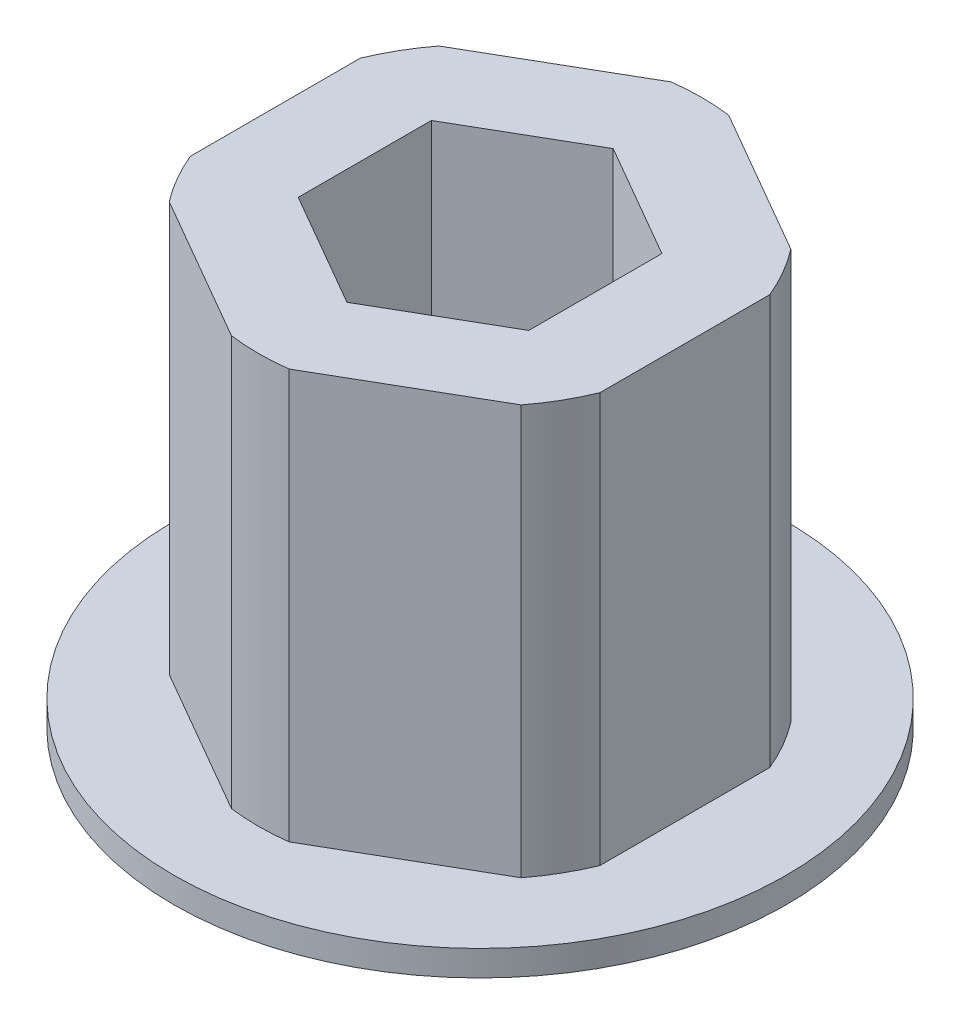
ISO-10303-21;
HEADER;
FILE_DESCRIPTION(('STEP AP214'),'2;1');
FILE_NAME('part.step','',(''),(''),'','','');
FILE_SCHEMA(('AUTOMOTIVE_DESIGN { 1 0 10303 214 1 1 1 1 }'));
ENDSEC;
DATA;
#1=APPLICATION_CONTEXT('core data for automotive mechanical design processes');
#2=APPLICATION_PROTOCOL_DEFINITION('international standard','automotive_design',2000,#1);
#3=PRODUCT_CONTEXT('',#1,'mechanical');
#4=PRODUCT('Part','Part','',(#3));
#5=PRODUCT_RELATED_PRODUCT_CATEGORY('part','',(#4));
#6=PRODUCT_DEFINITION_FORMATION('','',#4);
#7=PRODUCT_DEFINITION_CONTEXT('part definition',#1,'design');
#8=PRODUCT_DEFINITION('design','',#6,#7);
#9=PRODUCT_DEFINITION_SHAPE('','',#8);
#10=(LENGTH_UNIT() NAMED_UNIT(*) SI_UNIT(.MILLI.,.METRE.));
#11=(NAMED_UNIT(*) PLANE_ANGLE_UNIT() SI_UNIT($,.RADIAN.));
#12=(NAMED_UNIT(*) SI_UNIT($,.STERADIAN.) SOLID_ANGLE_UNIT());
#13=UNCERTAINTY_MEASURE_WITH_UNIT(LENGTH_MEASURE(1.E-05),#10,'distance_accuracy_value','');
#14=(GEOMETRIC_REPRESENTATION_CONTEXT(3) GLOBAL_UNCERTAINTY_ASSIGNED_CONTEXT((#13)) GLOBAL_UNIT_ASSIGNED_CONTEXT((#10,
#11,#12)) REPRESENTATION_CONTEXT('',''));
#15=CARTESIAN_POINT('',(0.,0.,0.));
#16=DIRECTION('',(0.,0.,1.));
#17=DIRECTION('',(1.,0.,0.));
#18=AXIS2_PLACEMENT_3D('',#15,#16,#17);
#19=CARTESIAN_POINT('',(0.,0.79375,0.));
#20=DIRECTION('',(0.,1.,0.));
#21=DIRECTION('',(0.,0.,1.));
#22=AXIS2_PLACEMENT_3D('',#19,#20,#21);
#23=PLANE('',#22);
#24=CARTESIAN_POINT('',(0.,0.79375,0.));
#25=DIRECTION('',(0.,1.,0.));
#26=DIRECTION('',(0.,0.,1.));
#27=AXIS2_PLACEMENT_3D('',#24,#25,#26);
#28=CIRCLE('',#27,6.875);
#29=CARTESIAN_POINT('',(5.45696050579321,0.79375,4.18177080173138));
#30=VERTEX_POINT('',#29);
#31=CARTESIAN_POINT('',(6.35,0.79375,2.63498102459961));
#32=VERTEX_POINT('',#31);
#33=EDGE_CURVE('E199',#30,#32,#28,.T.);
#34=ORIENTED_EDGE('',*,*,#33,.F.);
#35=DIRECTION('',(0.866025403784439,0.,-0.5));
#36=VECTOR('',#35,1.);
#37=CARTESIAN_POINT('',(3.175,0.79375,5.49926131403118));
#38=LINE('',#37,#36);
#39=CARTESIAN_POINT('',(0.893039494206787,0.79375,6.81675182633099));
#40=VERTEX_POINT('',#39);
#41=EDGE_CURVE('E228',#40,#30,#38,.T.);
#42=ORIENTED_EDGE('',*,*,#41,.F.);
#43=CARTESIAN_POINT('',(-0.893039494206786,0.793749999999999,6.81675182633099));
#44=VERTEX_POINT('',#43);
#45=EDGE_CURVE('E194',#44,#40,#28,.T.);
#46=ORIENTED_EDGE('',*,*,#45,.F.);
#47=DIRECTION('',(0.866025403784439,0.,0.5));
#48=VECTOR('',#47,1.);
#49=CARTESIAN_POINT('',(-3.175,0.79375,5.49926131403118));
#50=LINE('',#49,#48);
#51=CARTESIAN_POINT('',(-5.45696050579321,0.79375,4.18177080173138));
#52=VERTEX_POINT('',#51);
#53=EDGE_CURVE('E196',#52,#44,#50,.T.);
#54=ORIENTED_EDGE('',*,*,#53,.F.);
#55=CARTESIAN_POINT('',(-6.35,0.79375,2.63498102459961));
#56=VERTEX_POINT('',#55);
#57=EDGE_CURVE('E198',#56,#52,#28,.T.);
#58=ORIENTED_EDGE('',*,*,#57,.F.);
#59=DIRECTION('',(0.,0.,1.));
#60=VECTOR('',#59,1.);
#61=CARTESIAN_POINT('',(-6.35,0.79375,0.));
#62=LINE('',#61,#60);
#63=CARTESIAN_POINT('',(-6.35,0.79375,-2.63498102459961));
#64=VERTEX_POINT('',#63);
#65=EDGE_CURVE('E240',#64,#56,#62,.T.);
#66=ORIENTED_EDGE('',*,*,#65,.F.);
#67=CARTESIAN_POINT('',(-5.45696050579321,0.79375,-4.18177080173138));
#68=VERTEX_POINT('',#67);
#69=EDGE_CURVE('E239',#68,#64,#28,.T.);
#70=ORIENTED_EDGE('',*,*,#69,.F.);
#71=DIRECTION('',(-0.866025403784439,0.,0.5));
#72=VECTOR('',#71,1.);
#73=CARTESIAN_POINT('',(-3.175,0.79375,-5.49926131403119));
#74=LINE('',#73,#72);
#75=CARTESIAN_POINT('',(-0.893039494206791,0.79375,-6.81675182633099));
#76=VERTEX_POINT('',#75);
#77=EDGE_CURVE('E237',#76,#68,#74,.T.);
#78=ORIENTED_EDGE('',*,*,#77,.F.);
#79=CARTESIAN_POINT('',(0.893039494206787,0.79375,-6.81675182633099));
#80=VERTEX_POINT('',#79);
#81=EDGE_CURVE('E236',#80,#76,#28,.T.);
#82=ORIENTED_EDGE('',*,*,#81,.F.);
#83=DIRECTION('',(-0.866025403784439,0.,-0.5));
#84=VECTOR('',#83,1.);
#85=CARTESIAN_POINT('',(3.175,0.79375,-5.49926131403118));
#86=LINE('',#85,#84);
#87=CARTESIAN_POINT('',(5.45696050579321,0.79375,-4.18177080173138));
#88=VERTEX_POINT('',#87);
#89=EDGE_CURVE('E234',#88,#80,#86,.T.);
#90=ORIENTED_EDGE('',*,*,#89,.F.);
#91=CARTESIAN_POINT('',(6.35,0.79375,-2.63498102459961));
#92=VERTEX_POINT('',#91);
#93=EDGE_CURVE('E232',#92,#88,#28,.T.);
#94=ORIENTED_EDGE('',*,*,#93,.F.);
#95=DIRECTION('',(0.,0.,-1.));
#96=VECTOR('',#95,1.);
#97=CARTESIAN_POINT('',(6.35,0.79375,0.));
#98=LINE('',#97,#96);
#99=EDGE_CURVE('E231',#32,#92,#98,.T.);
#100=ORIENTED_EDGE('',*,*,#99,.F.);
#101=EDGE_LOOP('',(#34,#42,#46,#54,#58,#66,#70,#78,#82,#90,#94,#100));
#102=FACE_BOUND('',#101,.T.);
#103=CARTESIAN_POINT('',(0.,0.79375,0.));
#104=DIRECTION('',(0.,1.,0.));
#105=DIRECTION('',(0.,0.,1.));
#106=AXIS2_PLACEMENT_3D('',#103,#104,#105);
#107=CIRCLE('',#106,9.5);
#108=CARTESIAN_POINT('',(0.,0.79375,9.5));
#109=VERTEX_POINT('',#108);
#110=EDGE_CURVE('E11',#109,#109,#107,.T.);
#111=ORIENTED_EDGE('',*,*,#110,.T.);
#112=EDGE_LOOP('',(#111));
#113=FACE_BOUND('',#112,.T.);
#114=ADVANCED_FACE('F41',(#102,#113),#23,.T.);
#115=CARTESIAN_POINT('',(0.,0.,0.));
#116=DIRECTION('',(0.,1.,0.));
#117=DIRECTION('',(0.,0.,1.));
#118=AXIS2_PLACEMENT_3D('',#115,#116,#117);
#119=PLANE('',#118);
#120=CARTESIAN_POINT('',(0.,0.,0.));
#121=DIRECTION('',(0.,1.,0.));
#122=DIRECTION('',(0.,0.,1.));
#123=AXIS2_PLACEMENT_3D('',#120,#121,#122);
#124=CIRCLE('',#123,9.5);
#125=CARTESIAN_POINT('',(0.,0.,9.5));
#126=VERTEX_POINT('',#125);
#127=EDGE_CURVE('E45',#126,#126,#124,.T.);
#128=ORIENTED_EDGE('',*,*,#127,.F.);
#129=EDGE_LOOP('',(#128));
#130=FACE_BOUND('',#129,.T.);
#131=DIRECTION('',(-0.866025403784442,0.,-0.499999999999995));
#132=VECTOR('',#131,1.);
#133=CARTESIAN_POINT('',(3.57499999999998,0.,-2.06402721235295));
#134=LINE('',#133,#132);
#135=CARTESIAN_POINT('',(3.57499999999998,0.,-2.06402721235295));
#136=VERTEX_POINT('',#135);
#137=CARTESIAN_POINT('',(0.,0.,-4.12805442470582));
#138=VERTEX_POINT('',#137);
#139=EDGE_CURVE('E64',#136,#138,#134,.T.);
#140=ORIENTED_EDGE('',*,*,#139,.T.);
#141=DIRECTION('',(-0.866025403784438,0.,0.500000000000001));
#142=VECTOR('',#141,1.);
#143=CARTESIAN_POINT('',(0.,0.,-4.12805442470582));
#144=LINE('',#143,#142);
#145=CARTESIAN_POINT('',(-3.575,0.,-2.0640272123529));
#146=VERTEX_POINT('',#145);
#147=EDGE_CURVE('E277',#138,#146,#144,.T.);
#148=ORIENTED_EDGE('',*,*,#147,.T.);
#149=DIRECTION('',(0.,0.,1.));
#150=VECTOR('',#149,1.);
#151=CARTESIAN_POINT('',(-3.575,0.,-2.0640272123529));
#152=LINE('',#151,#150);
#153=CARTESIAN_POINT('',(-3.57499999999999,0.,2.06402721235293));
#154=VERTEX_POINT('',#153);
#155=EDGE_CURVE('E174',#146,#154,#152,.T.);
#156=ORIENTED_EDGE('',*,*,#155,.T.);
#157=DIRECTION('',(0.866025403784441,0.,0.499999999999995));
#158=VECTOR('',#157,1.);
#159=CARTESIAN_POINT('',(-3.57499999999999,0.,2.06402721235293));
#160=LINE('',#159,#158);
#161=CARTESIAN_POINT('',(0.,0.,4.12805442470582));
#162=VERTEX_POINT('',#161);
#163=EDGE_CURVE('E280',#154,#162,#160,.T.);
#164=ORIENTED_EDGE('',*,*,#163,.T.);
#165=DIRECTION('',(0.866025403784435,0.,-0.500000000000007));
#166=VECTOR('',#165,1.);
#167=CARTESIAN_POINT('',(0.,0.,4.12805442470582));
#168=LINE('',#167,#166);
#169=CARTESIAN_POINT('',(3.57500000000002,0.,2.06402721235288));
#170=VERTEX_POINT('',#169);
#171=EDGE_CURVE('E283',#162,#170,#168,.T.);
#172=ORIENTED_EDGE('',*,*,#171,.T.);
#173=DIRECTION('',(0.,0.,-1.));
#174=VECTOR('',#173,1.);
#175=CARTESIAN_POINT('',(3.57500000000002,0.,2.06402721235288));
#176=LINE('',#175,#174);
#177=EDGE_CURVE('E286',#170,#136,#176,.T.);
#178=ORIENTED_EDGE('',*,*,#177,.T.);
#179=EDGE_LOOP('',(#140,#148,#156,#164,#172,#178));
#180=FACE_BOUND('',#179,.T.);
#181=ADVANCED_FACE('F300',(#130,#180),#119,.F.);
#182=CARTESIAN_POINT('',(0.,0.79375,0.));
#183=DIRECTION('',(0.,-1.,0.));
#184=DIRECTION('',(0.,0.,-1.));
#185=AXIS2_PLACEMENT_3D('',#182,#183,#184);
#186=CYLINDRICAL_SURFACE('',#185,9.5);
#187=ORIENTED_EDGE('',*,*,#110,.F.);
#188=EDGE_LOOP('',(#187));
#189=FACE_BOUND('',#188,.T.);
#190=ORIENTED_EDGE('',*,*,#127,.T.);
#191=EDGE_LOOP('',(#190));
#192=FACE_BOUND('',#191,.T.);
#193=ADVANCED_FACE('F43',(#189,#192),#186,.T.);
#194=CARTESIAN_POINT('',(3.57499999999998,0.79375,-2.06402721235295));
#195=DIRECTION('',(-0.499999999999995,0.,0.866025403784442));
#196=DIRECTION('',(0.866025403784442,0.,0.499999999999995));
#197=AXIS2_PLACEMENT_3D('',#194,#195,#196);
#198=PLANE('',#197);
#199=ORIENTED_EDGE('',*,*,#139,.F.);
#200=DIRECTION('',(0.,-1.,0.));
#201=VECTOR('',#200,1.);
#202=CARTESIAN_POINT('',(3.57499999999998,0.79375,-2.06402721235295));
#203=LINE('',#202,#201);
#204=CARTESIAN_POINT('',(3.57499999999998,13.49375,-2.06402721235295));
#205=VERTEX_POINT('',#204);
#206=EDGE_CURVE('E289',#205,#136,#203,.T.);
#207=ORIENTED_EDGE('',*,*,#206,.F.);
#208=DIRECTION('',(0.866025403784442,0.,0.499999999999995));
#209=VECTOR('',#208,1.);
#210=CARTESIAN_POINT('',(1.78749999999999,13.49375,-3.09604081852939));
#211=LINE('',#210,#209);
#212=CARTESIAN_POINT('',(0.,13.49375,-4.12805442470582));
#213=VERTEX_POINT('',#212);
#214=EDGE_CURVE('E186',#213,#205,#211,.T.);
#215=ORIENTED_EDGE('',*,*,#214,.F.);
#216=DIRECTION('',(0.,-1.,0.));
#217=VECTOR('',#216,1.);
#218=CARTESIAN_POINT('',(0.,0.79375,-4.12805442470582));
#219=LINE('',#218,#217);
#220=EDGE_CURVE('E177',#213,#138,#219,.T.);
#221=ORIENTED_EDGE('',*,*,#220,.T.);
#222=EDGE_LOOP('',(#199,#207,#215,#221));
#223=FACE_BOUND('',#222,.T.);
#224=ADVANCED_FACE('F308',(#223),#198,.T.);
#225=CARTESIAN_POINT('',(0.,0.79375,-4.12805442470582));
#226=DIRECTION('',(0.500000000000001,0.,0.866025403784438));
#227=DIRECTION('',(0.866025403784438,0.,-0.500000000000001));
#228=AXIS2_PLACEMENT_3D('',#225,#226,#227);
#229=PLANE('',#228);
#230=ORIENTED_EDGE('',*,*,#147,.F.);
#231=ORIENTED_EDGE('',*,*,#220,.F.);
#232=DIRECTION('',(0.866025403784438,0.,-0.500000000000001));
#233=VECTOR('',#232,1.);
#234=CARTESIAN_POINT('',(-1.7875,13.49375,-3.09604081852936));
#235=LINE('',#234,#233);
#236=CARTESIAN_POINT('',(-3.575,13.49375,-2.0640272123529));
#237=VERTEX_POINT('',#236);
#238=EDGE_CURVE('E181',#237,#213,#235,.T.);
#239=ORIENTED_EDGE('',*,*,#238,.F.);
#240=DIRECTION('',(0.,-1.,0.));
#241=VECTOR('',#240,1.);
#242=CARTESIAN_POINT('',(-3.575,0.79375,-2.0640272123529));
#243=LINE('',#242,#241);
#244=EDGE_CURVE('E168',#237,#146,#243,.T.);
#245=ORIENTED_EDGE('',*,*,#244,.T.);
#246=EDGE_LOOP('',(#230,#231,#239,#245));
#247=FACE_BOUND('',#246,.T.);
#248=ADVANCED_FACE('F182',(#247),#229,.T.);
#249=CARTESIAN_POINT('',(-3.575,0.79375,-2.0640272123529));
#250=DIRECTION('',(1.,0.,0.));
#251=DIRECTION('',(0.,0.,-1.));
#252=AXIS2_PLACEMENT_3D('',#249,#250,#251);
#253=PLANE('',#252);
#254=ORIENTED_EDGE('',*,*,#155,.F.);
#255=ORIENTED_EDGE('',*,*,#244,.F.);
#256=DIRECTION('',(0.,0.,-1.));
#257=VECTOR('',#256,1.);
#258=CARTESIAN_POINT('',(-3.575,13.49375,0.));
#259=LINE('',#258,#257);
#260=CARTESIAN_POINT('',(-3.57499999999999,13.49375,2.06402721235293));
#261=VERTEX_POINT('',#260);
#262=EDGE_CURVE('E172',#261,#237,#259,.T.);
#263=ORIENTED_EDGE('',*,*,#262,.F.);
#264=DIRECTION('',(0.,-1.,0.));
#265=VECTOR('',#264,1.);
#266=CARTESIAN_POINT('',(-3.57499999999999,0.79375,2.06402721235293));
#267=LINE('',#266,#265);
#268=EDGE_CURVE('E178',#261,#154,#267,.T.);
#269=ORIENTED_EDGE('',*,*,#268,.T.);
#270=EDGE_LOOP('',(#254,#255,#263,#269));
#271=FACE_BOUND('',#270,.T.);
#272=ADVANCED_FACE('F170',(#271),#253,.T.);
#273=CARTESIAN_POINT('',(-3.57499999999999,0.79375,2.06402721235293));
#274=DIRECTION('',(0.499999999999995,0.,-0.866025403784441));
#275=DIRECTION('',(-0.866025403784441,0.,-0.499999999999995));
#276=AXIS2_PLACEMENT_3D('',#273,#274,#275);
#277=PLANE('',#276);
#278=ORIENTED_EDGE('',*,*,#163,.F.);
#279=ORIENTED_EDGE('',*,*,#268,.F.);
#280=DIRECTION('',(-0.866025403784442,0.,-0.499999999999995));
#281=VECTOR('',#280,1.);
#282=CARTESIAN_POINT('',(-1.78749999999998,13.49375,3.09604081852938));
#283=LINE('',#282,#281);
#284=CARTESIAN_POINT('',(0.,13.49375,4.12805442470582));
#285=VERTEX_POINT('',#284);
#286=EDGE_CURVE('E193',#285,#261,#283,.T.);
#287=ORIENTED_EDGE('',*,*,#286,.F.);
#288=DIRECTION('',(0.,-1.,0.));
#289=VECTOR('',#288,1.);
#290=CARTESIAN_POINT('',(0.,0.79375,4.12805442470582));
#291=LINE('',#290,#289);
#292=EDGE_CURVE('E293',#285,#162,#291,.T.);
#293=ORIENTED_EDGE('',*,*,#292,.T.);
#294=EDGE_LOOP('',(#278,#279,#287,#293));
#295=FACE_BOUND('',#294,.T.);
#296=ADVANCED_FACE('F314',(#295),#277,.T.);
#297=CARTESIAN_POINT('',(0.,0.79375,4.12805442470582));
#298=DIRECTION('',(-0.500000000000007,0.,-0.866025403784434));
#299=DIRECTION('',(-0.866025403784435,0.,0.500000000000007));
#300=AXIS2_PLACEMENT_3D('',#297,#298,#299);
#301=PLANE('',#300);
#302=ORIENTED_EDGE('',*,*,#171,.F.);
#303=ORIENTED_EDGE('',*,*,#292,.F.);
#304=DIRECTION('',(-0.866025403784435,0.,0.500000000000007));
#305=VECTOR('',#304,1.);
#306=CARTESIAN_POINT('',(1.78750000000002,13.49375,3.09604081852935));
#307=LINE('',#306,#305);
#308=CARTESIAN_POINT('',(3.57500000000002,13.49375,2.06402721235288));
#309=VERTEX_POINT('',#308);
#310=EDGE_CURVE('E205',#309,#285,#307,.T.);
#311=ORIENTED_EDGE('',*,*,#310,.F.);
#312=DIRECTION('',(0.,-1.,0.));
#313=VECTOR('',#312,1.);
#314=CARTESIAN_POINT('',(3.57500000000002,0.79375,2.06402721235288));
#315=LINE('',#314,#313);
#316=EDGE_CURVE('E291',#309,#170,#315,.T.);
#317=ORIENTED_EDGE('',*,*,#316,.T.);
#318=EDGE_LOOP('',(#302,#303,#311,#317));
#319=FACE_BOUND('',#318,.T.);
#320=ADVANCED_FACE('F311',(#319),#301,.T.);
#321=CARTESIAN_POINT('',(3.57500000000002,0.79375,2.06402721235288));
#322=DIRECTION('',(-1.,0.,0.));
#323=DIRECTION('',(0.,0.,1.));
#324=AXIS2_PLACEMENT_3D('',#321,#322,#323);
#325=PLANE('',#324);
#326=ORIENTED_EDGE('',*,*,#177,.F.);
#327=ORIENTED_EDGE('',*,*,#316,.F.);
#328=DIRECTION('',(0.,0.,1.));
#329=VECTOR('',#328,1.);
#330=CARTESIAN_POINT('',(3.575,13.49375,0.));
#331=LINE('',#330,#329);
#332=EDGE_CURVE('E202',#205,#309,#331,.T.);
#333=ORIENTED_EDGE('',*,*,#332,.F.);
#334=ORIENTED_EDGE('',*,*,#206,.T.);
#335=EDGE_LOOP('',(#326,#327,#333,#334));
#336=FACE_BOUND('',#335,.T.);
#337=ADVANCED_FACE('F306',(#336),#325,.T.);
#338=CARTESIAN_POINT('',(3.175,13.49375,5.49926131403118));
#339=DIRECTION('',(-0.5,0.,-0.866025403784439));
#340=DIRECTION('',(-0.866025403784439,0.,0.5));
#341=AXIS2_PLACEMENT_3D('',#338,#339,#340);
#342=PLANE('',#341);
#343=ORIENTED_EDGE('',*,*,#41,.T.);
#344=DIRECTION('',(0.,-1.,0.));
#345=VECTOR('',#344,1.);
#346=CARTESIAN_POINT('',(5.45696050579321,13.49375,4.18177080173138));
#347=LINE('',#346,#345);
#348=CARTESIAN_POINT('',(5.45696050579321,13.49375,4.18177080173138));
#349=VERTEX_POINT('',#348);
#350=EDGE_CURVE('E274',#349,#30,#347,.T.);
#351=ORIENTED_EDGE('',*,*,#350,.F.);
#352=DIRECTION('',(0.866025403784439,0.,-0.5));
#353=VECTOR('',#352,1.);
#354=CARTESIAN_POINT('',(3.175,13.49375,5.49926131403118));
#355=LINE('',#354,#353);
#356=CARTESIAN_POINT('',(0.893039494206787,13.49375,6.81675182633099));
#357=VERTEX_POINT('',#356);
#358=EDGE_CURVE('E208',#357,#349,#355,.T.);
#359=ORIENTED_EDGE('',*,*,#358,.F.);
#360=DIRECTION('',(0.,-1.,0.));
#361=VECTOR('',#360,1.);
#362=CARTESIAN_POINT('',(0.893039494206787,13.49375,6.81675182633099));
#363=LINE('',#362,#361);
#364=EDGE_CURVE('E243',#357,#40,#363,.T.);
#365=ORIENTED_EDGE('',*,*,#364,.T.);
#366=EDGE_LOOP('',(#343,#351,#359,#365));
#367=FACE_BOUND('',#366,.T.);
#368=ADVANCED_FACE('F365',(#367),#342,.F.);
#369=CARTESIAN_POINT('',(0.,13.49375,0.));
#370=DIRECTION('',(0.,-1.,0.));
#371=DIRECTION('',(0.,0.,-1.));
#372=AXIS2_PLACEMENT_3D('',#369,#370,#371);
#373=CYLINDRICAL_SURFACE('',#372,6.875);
#374=ORIENTED_EDGE('',*,*,#33,.T.);
#375=DIRECTION('',(0.,-1.,0.));
#376=VECTOR('',#375,1.);
#377=CARTESIAN_POINT('',(6.35,13.49375,2.63498102459961));
#378=LINE('',#377,#376);
#379=CARTESIAN_POINT('',(6.35,13.49375,2.63498102459961));
#380=VERTEX_POINT('',#379);
#381=EDGE_CURVE('E271',#380,#32,#378,.T.);
#382=ORIENTED_EDGE('',*,*,#381,.F.);
#383=CARTESIAN_POINT('',(0.,13.49375,0.));
#384=DIRECTION('',(0.,1.,0.));
#385=DIRECTION('',(0.,0.,1.));
#386=AXIS2_PLACEMENT_3D('',#383,#384,#385);
#387=CIRCLE('',#386,6.875);
#388=EDGE_CURVE('E211',#349,#380,#387,.T.);
#389=ORIENTED_EDGE('',*,*,#388,.F.);
#390=ORIENTED_EDGE('',*,*,#350,.T.);
#391=EDGE_LOOP('',(#374,#382,#389,#390));
#392=FACE_BOUND('',#391,.T.);
#393=ADVANCED_FACE('F375',(#392),#373,.T.);
#394=CARTESIAN_POINT('',(6.35,13.49375,0.));
#395=DIRECTION('',(-1.,0.,0.));
#396=DIRECTION('',(0.,0.,1.));
#397=AXIS2_PLACEMENT_3D('',#394,#395,#396);
#398=PLANE('',#397);
#399=ORIENTED_EDGE('',*,*,#99,.T.);
#400=DIRECTION('',(0.,-1.,0.));
#401=VECTOR('',#400,1.);
#402=CARTESIAN_POINT('',(6.35,13.49375,-2.63498102459961));
#403=LINE('',#402,#401);
#404=CARTESIAN_POINT('',(6.35,13.49375,-2.63498102459961));
#405=VERTEX_POINT('',#404);
#406=EDGE_CURVE('E268',#405,#92,#403,.T.);
#407=ORIENTED_EDGE('',*,*,#406,.F.);
#408=DIRECTION('',(0.,0.,-1.));
#409=VECTOR('',#408,1.);
#410=CARTESIAN_POINT('',(6.35,13.49375,0.));
#411=LINE('',#410,#409);
#412=EDGE_CURVE('E213',#380,#405,#411,.T.);
#413=ORIENTED_EDGE('',*,*,#412,.F.);
#414=ORIENTED_EDGE('',*,*,#381,.T.);
#415=EDGE_LOOP('',(#399,#407,#413,#414));
#416=FACE_BOUND('',#415,.T.);
#417=ADVANCED_FACE('F386',(#416),#398,.F.);
#418=ORIENTED_EDGE('',*,*,#93,.T.);
#419=DIRECTION('',(0.,-1.,0.));
#420=VECTOR('',#419,1.);
#421=CARTESIAN_POINT('',(5.45696050579321,13.49375,-4.18177080173138));
#422=LINE('',#421,#420);
#423=CARTESIAN_POINT('',(5.45696050579321,13.49375,-4.18177080173138));
#424=VERTEX_POINT('',#423);
#425=EDGE_CURVE('E265',#424,#88,#422,.T.);
#426=ORIENTED_EDGE('',*,*,#425,.F.);
#427=EDGE_CURVE('E215',#405,#424,#387,.T.);
#428=ORIENTED_EDGE('',*,*,#427,.F.);
#429=ORIENTED_EDGE('',*,*,#406,.T.);
#430=EDGE_LOOP('',(#418,#426,#428,#429));
#431=FACE_BOUND('',#430,.T.);
#432=ADVANCED_FACE('F389',(#431),#373,.T.);
#433=CARTESIAN_POINT('',(3.175,13.49375,-5.49926131403118));
#434=DIRECTION('',(-0.5,0.,0.866025403784439));
#435=DIRECTION('',(0.866025403784439,0.,0.5));
#436=AXIS2_PLACEMENT_3D('',#433,#434,#435);
#437=PLANE('',#436);
#438=ORIENTED_EDGE('',*,*,#89,.T.);
#439=DIRECTION('',(0.,-1.,0.));
#440=VECTOR('',#439,1.);
#441=CARTESIAN_POINT('',(0.893039494206787,13.49375,-6.81675182633099));
#442=LINE('',#441,#440);
#443=CARTESIAN_POINT('',(0.893039494206787,13.49375,-6.81675182633099));
#444=VERTEX_POINT('',#443);
#445=EDGE_CURVE('E262',#444,#80,#442,.T.);
#446=ORIENTED_EDGE('',*,*,#445,.F.);
#447=DIRECTION('',(-0.866025403784439,0.,-0.5));
#448=VECTOR('',#447,1.);
#449=CARTESIAN_POINT('',(3.175,13.49375,-5.49926131403118));
#450=LINE('',#449,#448);
#451=EDGE_CURVE('E217',#424,#444,#450,.T.);
#452=ORIENTED_EDGE('',*,*,#451,.F.);
#453=ORIENTED_EDGE('',*,*,#425,.T.);
#454=EDGE_LOOP('',(#438,#446,#452,#453));
#455=FACE_BOUND('',#454,.T.);
#456=ADVANCED_FACE('F409',(#455),#437,.F.);
#457=ORIENTED_EDGE('',*,*,#81,.T.);
#458=DIRECTION('',(0.,-1.,0.));
#459=VECTOR('',#458,1.);
#460=CARTESIAN_POINT('',(-0.893039494206791,13.49375,-6.81675182633099));
#461=LINE('',#460,#459);
#462=CARTESIAN_POINT('',(-0.893039494206791,13.49375,-6.81675182633099));
#463=VERTEX_POINT('',#462);
#464=EDGE_CURVE('E259',#463,#76,#461,.T.);
#465=ORIENTED_EDGE('',*,*,#464,.F.);
#466=EDGE_CURVE('E219',#444,#463,#387,.T.);
#467=ORIENTED_EDGE('',*,*,#466,.F.);
#468=ORIENTED_EDGE('',*,*,#445,.T.);
#469=EDGE_LOOP('',(#457,#465,#467,#468));
#470=FACE_BOUND('',#469,.T.);
#471=ADVANCED_FACE('F411',(#470),#373,.T.);
#472=CARTESIAN_POINT('',(-3.175,13.49375,-5.49926131403119));
#473=DIRECTION('',(0.5,0.,0.866025403784439));
#474=DIRECTION('',(0.866025403784439,0.,-0.5));
#475=AXIS2_PLACEMENT_3D('',#472,#473,#474);
#476=PLANE('',#475);
#477=ORIENTED_EDGE('',*,*,#77,.T.);
#478=DIRECTION('',(0.,-1.,0.));
#479=VECTOR('',#478,1.);
#480=CARTESIAN_POINT('',(-5.45696050579321,13.49375,-4.18177080173138));
#481=LINE('',#480,#479);
#482=CARTESIAN_POINT('',(-5.45696050579321,13.49375,-4.18177080173138));
#483=VERTEX_POINT('',#482);
#484=EDGE_CURVE('E256',#483,#68,#481,.T.);
#485=ORIENTED_EDGE('',*,*,#484,.F.);
#486=DIRECTION('',(-0.866025403784439,0.,0.5));
#487=VECTOR('',#486,1.);
#488=CARTESIAN_POINT('',(-3.175,13.49375,-5.49926131403119));
#489=LINE('',#488,#487);
#490=EDGE_CURVE('E220',#463,#483,#489,.T.);
#491=ORIENTED_EDGE('',*,*,#490,.F.);
#492=ORIENTED_EDGE('',*,*,#464,.T.);
#493=EDGE_LOOP('',(#477,#485,#491,#492));
#494=FACE_BOUND('',#493,.T.);
#495=ADVANCED_FACE('F430',(#494),#476,.F.);
#496=ORIENTED_EDGE('',*,*,#69,.T.);
#497=DIRECTION('',(0.,-1.,0.));
#498=VECTOR('',#497,1.);
#499=CARTESIAN_POINT('',(-6.35,13.49375,-2.63498102459961));
#500=LINE('',#499,#498);
#501=CARTESIAN_POINT('',(-6.35,13.49375,-2.63498102459961));
#502=VERTEX_POINT('',#501);
#503=EDGE_CURVE('E253',#502,#64,#500,.T.);
#504=ORIENTED_EDGE('',*,*,#503,.F.);
#505=EDGE_CURVE('E222',#483,#502,#387,.T.);
#506=ORIENTED_EDGE('',*,*,#505,.F.);
#507=ORIENTED_EDGE('',*,*,#484,.T.);
#508=EDGE_LOOP('',(#496,#504,#506,#507));
#509=FACE_BOUND('',#508,.T.);
#510=ADVANCED_FACE('F432',(#509),#373,.T.);
#511=CARTESIAN_POINT('',(-6.35,13.49375,0.));
#512=DIRECTION('',(1.,0.,0.));
#513=DIRECTION('',(0.,0.,-1.));
#514=AXIS2_PLACEMENT_3D('',#511,#512,#513);
#515=PLANE('',#514);
#516=ORIENTED_EDGE('',*,*,#65,.T.);
#517=DIRECTION('',(0.,-1.,0.));
#518=VECTOR('',#517,1.);
#519=CARTESIAN_POINT('',(-6.35,13.49375,2.63498102459961));
#520=LINE('',#519,#518);
#521=CARTESIAN_POINT('',(-6.35,13.49375,2.63498102459961));
#522=VERTEX_POINT('',#521);
#523=EDGE_CURVE('E250',#522,#56,#520,.T.);
#524=ORIENTED_EDGE('',*,*,#523,.F.);
#525=DIRECTION('',(0.,0.,1.));
#526=VECTOR('',#525,1.);
#527=CARTESIAN_POINT('',(-6.35,13.49375,0.));
#528=LINE('',#527,#526);
#529=EDGE_CURVE('E223',#502,#522,#528,.T.);
#530=ORIENTED_EDGE('',*,*,#529,.F.);
#531=ORIENTED_EDGE('',*,*,#503,.T.);
#532=EDGE_LOOP('',(#516,#524,#530,#531));
#533=FACE_BOUND('',#532,.T.);
#534=ADVANCED_FACE('F451',(#533),#515,.F.);
#535=ORIENTED_EDGE('',*,*,#57,.T.);
#536=DIRECTION('',(0.,-1.,0.));
#537=VECTOR('',#536,1.);
#538=CARTESIAN_POINT('',(-5.45696050579321,13.49375,4.18177080173138));
#539=LINE('',#538,#537);
#540=CARTESIAN_POINT('',(-5.45696050579321,13.49375,4.18177080173138));
#541=VERTEX_POINT('',#540);
#542=EDGE_CURVE('E247',#541,#52,#539,.T.);
#543=ORIENTED_EDGE('',*,*,#542,.F.);
#544=EDGE_CURVE('E225',#522,#541,#387,.T.);
#545=ORIENTED_EDGE('',*,*,#544,.F.);
#546=ORIENTED_EDGE('',*,*,#523,.T.);
#547=EDGE_LOOP('',(#535,#543,#545,#546));
#548=FACE_BOUND('',#547,.T.);
#549=ADVANCED_FACE('F453',(#548),#373,.T.);
#550=CARTESIAN_POINT('',(-3.175,13.49375,5.49926131403118));
#551=DIRECTION('',(0.5,0.,-0.866025403784439));
#552=DIRECTION('',(-0.866025403784439,0.,-0.5));
#553=AXIS2_PLACEMENT_3D('',#550,#551,#552);
#554=PLANE('',#553);
#555=ORIENTED_EDGE('',*,*,#53,.T.);
#556=DIRECTION('',(0.,-1.,0.));
#557=VECTOR('',#556,1.);
#558=CARTESIAN_POINT('',(-0.893039494206786,13.49375,6.81675182633099));
#559=LINE('',#558,#557);
#560=CARTESIAN_POINT('',(-0.893039494206786,13.49375,6.81675182633099));
#561=VERTEX_POINT('',#560);
#562=EDGE_CURVE('E56',#561,#44,#559,.T.);
#563=ORIENTED_EDGE('',*,*,#562,.F.);
#564=DIRECTION('',(0.866025403784439,0.,0.5));
#565=VECTOR('',#564,1.);
#566=CARTESIAN_POINT('',(-3.175,13.49375,5.49926131403118));
#567=LINE('',#566,#565);
#568=EDGE_CURVE('E226',#541,#561,#567,.T.);
#569=ORIENTED_EDGE('',*,*,#568,.F.);
#570=ORIENTED_EDGE('',*,*,#542,.T.);
#571=EDGE_LOOP('',(#555,#563,#569,#570));
#572=FACE_BOUND('',#571,.T.);
#573=ADVANCED_FACE('F472',(#572),#554,.F.);
#574=ORIENTED_EDGE('',*,*,#45,.T.);
#575=ORIENTED_EDGE('',*,*,#364,.F.);
#576=EDGE_CURVE('E214',#561,#357,#387,.T.);
#577=ORIENTED_EDGE('',*,*,#576,.F.);
#578=ORIENTED_EDGE('',*,*,#562,.T.);
#579=EDGE_LOOP('',(#574,#575,#577,#578));
#580=FACE_BOUND('',#579,.T.);
#581=ADVANCED_FACE('F390',(#580),#373,.T.);
#582=CARTESIAN_POINT('',(0.,13.49375,0.));
#583=DIRECTION('',(0.,1.,0.));
#584=DIRECTION('',(0.,0.,1.));
#585=AXIS2_PLACEMENT_3D('',#582,#583,#584);
#586=PLANE('',#585);
#587=ORIENTED_EDGE('',*,*,#262,.T.);
#588=ORIENTED_EDGE('',*,*,#238,.T.);
#589=ORIENTED_EDGE('',*,*,#214,.T.);
#590=ORIENTED_EDGE('',*,*,#332,.T.);
#591=ORIENTED_EDGE('',*,*,#310,.T.);
#592=ORIENTED_EDGE('',*,*,#286,.T.);
#593=EDGE_LOOP('',(#587,#588,#589,#590,#591,#592));
#594=FACE_BOUND('',#593,.T.);
#595=ORIENTED_EDGE('',*,*,#358,.T.);
#596=ORIENTED_EDGE('',*,*,#388,.T.);
#597=ORIENTED_EDGE('',*,*,#412,.T.);
#598=ORIENTED_EDGE('',*,*,#427,.T.);
#599=ORIENTED_EDGE('',*,*,#451,.T.);
#600=ORIENTED_EDGE('',*,*,#466,.T.);
#601=ORIENTED_EDGE('',*,*,#490,.T.);
#602=ORIENTED_EDGE('',*,*,#505,.T.);
#603=ORIENTED_EDGE('',*,*,#529,.T.);
#604=ORIENTED_EDGE('',*,*,#544,.T.);
#605=ORIENTED_EDGE('',*,*,#568,.T.);
#606=ORIENTED_EDGE('',*,*,#576,.T.);
#607=EDGE_LOOP('',(#595,#596,#597,#598,#599,#600,#601,#602,#603,#604,#605,#606));
#608=FACE_BOUND('',#607,.T.);
#609=ADVANCED_FACE('F189',(#594,#608),#586,.T.);
#610=CLOSED_SHELL('',(#114,#181,#193,#224,#248,#272,#296,#320,#337,#368,#393,#417,#432,#456,
#471,#495,#510,#534,#549,#573,#581,#609));
#611=MANIFOLD_SOLID_BREP('B2',#610);
#612=ADVANCED_BREP_SHAPE_REPRESENTATION('',(#18,#611),#14);
#613=SHAPE_DEFINITION_REPRESENTATION(#9,#612);
ENDSEC;
END-ISO-10303-21;
